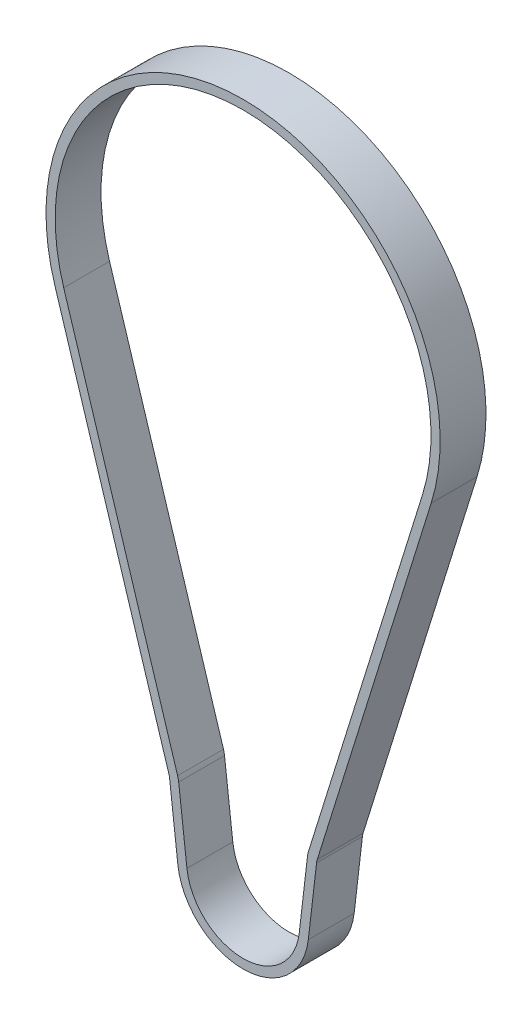
ISO-10303-21;
HEADER;
FILE_DESCRIPTION(('STEP AP214'),'2;1');
FILE_NAME('part.step','',(''),(''),'','','');
FILE_SCHEMA(('AUTOMOTIVE_DESIGN { 1 0 10303 214 1 1 1 1 }'));
ENDSEC;
DATA;
#1=APPLICATION_CONTEXT('core data for automotive mechanical design processes');
#2=APPLICATION_PROTOCOL_DEFINITION('international standard','automotive_design',2000,#1);
#3=PRODUCT_CONTEXT('',#1,'mechanical');
#4=PRODUCT('Part','Part','',(#3));
#5=PRODUCT_RELATED_PRODUCT_CATEGORY('part','',(#4));
#6=PRODUCT_DEFINITION_FORMATION('','',#4);
#7=PRODUCT_DEFINITION_CONTEXT('part definition',#1,'design');
#8=PRODUCT_DEFINITION('design','',#6,#7);
#9=PRODUCT_DEFINITION_SHAPE('','',#8);
#10=(LENGTH_UNIT() NAMED_UNIT(*) SI_UNIT(.MILLI.,.METRE.));
#11=(NAMED_UNIT(*) PLANE_ANGLE_UNIT() SI_UNIT($,.RADIAN.));
#12=(NAMED_UNIT(*) SI_UNIT($,.STERADIAN.) SOLID_ANGLE_UNIT());
#13=UNCERTAINTY_MEASURE_WITH_UNIT(LENGTH_MEASURE(1.E-05),#10,'distance_accuracy_value','');
#14=(GEOMETRIC_REPRESENTATION_CONTEXT(3) GLOBAL_UNCERTAINTY_ASSIGNED_CONTEXT((#13)) GLOBAL_UNIT_ASSIGNED_CONTEXT((#10,
#11,#12)) REPRESENTATION_CONTEXT('',''));
#15=CARTESIAN_POINT('',(0.,0.,0.));
#16=DIRECTION('',(0.,0.,1.));
#17=DIRECTION('',(1.,0.,0.));
#18=AXIS2_PLACEMENT_3D('',#15,#16,#17);
#19=CARTESIAN_POINT('',(0.,0.,5.));
#20=DIRECTION('',(0.,0.,1.));
#21=DIRECTION('',(1.,0.,0.));
#22=AXIS2_PLACEMENT_3D('',#19,#20,#21);
#23=PLANE('',#22);
#24=CARTESIAN_POINT('',(0.,0.,5.));
#25=DIRECTION('',(0.,0.,1.));
#26=DIRECTION('',(1.,0.,0.));
#27=AXIS2_PLACEMENT_3D('',#24,#25,#26);
#28=CIRCLE('',#27,14.325);
#29=CARTESIAN_POINT('',(-14.2282237592873,-1.66230973517308,5.));
#30=VERTEX_POINT('',#29);
#31=CARTESIAN_POINT('',(14.2282237592873,-1.66230973517308,5.));
#32=VERTEX_POINT('',#31);
#33=EDGE_CURVE('E213',#30,#32,#28,.T.);
#34=ORIENTED_EDGE('',*,*,#33,.T.);
#35=DIRECTION('',(0.116042564409988,0.993244241486028,0.));
#36=VECTOR('',#35,1.);
#37=CARTESIAN_POINT('',(14.2282237592873,-1.66230973517308,5.));
#38=LINE('',#37,#36);
#39=CARTESIAN_POINT('',(16.0270230340559,13.73417025764,5.));
#40=VERTEX_POINT('',#39);
#41=EDGE_CURVE('E216',#32,#40,#38,.T.);
#42=ORIENTED_EDGE('',*,*,#41,.T.);
#43=CARTESIAN_POINT('',(20.,13.27,5.));
#44=DIRECTION('',(0.,0.,-1.));
#45=DIRECTION('',(1.,0.,0.));
#46=AXIS2_PLACEMENT_3D('',#43,#44,#45);
#47=CIRCLE('',#46,4.);
#48=CARTESIAN_POINT('',(16.1811524732766,14.4601275425929,5.));
#49=VERTEX_POINT('',#48);
#50=EDGE_CURVE('E219',#40,#49,#47,.T.);
#51=ORIENTED_EDGE('',*,*,#50,.T.);
#52=DIRECTION('',(0.297531885648231,0.95471188168086,0.));
#53=VECTOR('',#52,1.);
#54=CARTESIAN_POINT('',(16.1811524732766,14.4601275425929,5.));
#55=LINE('',#54,#53);
#56=CARTESIAN_POINT('',(41.0239695558265,94.1750548736955,5.));
#57=VERTEX_POINT('',#56);
#58=EDGE_CURVE('E221',#49,#57,#55,.T.);
#59=ORIENTED_EDGE('',*,*,#58,.T.);
#60=CARTESIAN_POINT('',(0.,106.96,5.));
#61=DIRECTION('',(0.,0.,1.));
#62=DIRECTION('',(1.,0.,0.));
#63=AXIS2_PLACEMENT_3D('',#60,#61,#62);
#64=CIRCLE('',#63,42.97);
#65=CARTESIAN_POINT('',(-41.0239695558265,94.1750548736955,5.));
#66=VERTEX_POINT('',#65);
#67=EDGE_CURVE('E223',#57,#66,#64,.T.);
#68=ORIENTED_EDGE('',*,*,#67,.T.);
#69=DIRECTION('',(0.297531885648231,-0.95471188168086,0.));
#70=VECTOR('',#69,1.);
#71=CARTESIAN_POINT('',(-16.1811524732766,14.4601275425929,5.));
#72=LINE('',#71,#70);
#73=CARTESIAN_POINT('',(-16.1811524732766,14.4601275425929,5.));
#74=VERTEX_POINT('',#73);
#75=EDGE_CURVE('E225',#66,#74,#72,.T.);
#76=ORIENTED_EDGE('',*,*,#75,.T.);
#77=CARTESIAN_POINT('',(-20.,13.27,5.));
#78=DIRECTION('',(0.,0.,-1.));
#79=DIRECTION('',(1.,0.,0.));
#80=AXIS2_PLACEMENT_3D('',#77,#78,#79);
#81=CIRCLE('',#80,4.);
#82=CARTESIAN_POINT('',(-16.0270230340559,13.73417025764,5.));
#83=VERTEX_POINT('',#82);
#84=EDGE_CURVE('E227',#74,#83,#81,.T.);
#85=ORIENTED_EDGE('',*,*,#84,.T.);
#86=DIRECTION('',(0.116042564409988,-0.993244241486028,0.));
#87=VECTOR('',#86,1.);
#88=CARTESIAN_POINT('',(-14.2282237592873,-1.66230973517308,5.));
#89=LINE('',#88,#87);
#90=EDGE_CURVE('E229',#83,#30,#89,.T.);
#91=ORIENTED_EDGE('',*,*,#90,.T.);
#92=EDGE_LOOP('',(#34,#42,#51,#59,#68,#76,#85,#91));
#93=FACE_BOUND('',#92,.T.);
#94=DIRECTION('',(0.116042564409989,-0.993244241486027,0.));
#95=VECTOR('',#94,1.);
#96=CARTESIAN_POINT('',(-12.2417352763153,-1.4302246063531,5.));
#97=LINE('',#96,#95);
#98=CARTESIAN_POINT('',(-14.0405345510838,13.9662553864599,5.));
#99=VERTEX_POINT('',#98);
#100=CARTESIAN_POINT('',(-12.2417352763153,-1.4302246063531,5.));
#101=VERTEX_POINT('',#100);
#102=EDGE_CURVE('E156',#99,#101,#97,.T.);
#103=ORIENTED_EDGE('',*,*,#102,.F.);
#104=CARTESIAN_POINT('',(-20.,13.27,5.));
#105=DIRECTION('',(0.,0.,-1.));
#106=DIRECTION('',(1.,0.,0.));
#107=AXIS2_PLACEMENT_3D('',#104,#105,#106);
#108=CIRCLE('',#107,6.);
#109=CARTESIAN_POINT('',(-14.2717287099148,15.0551913138894,5.));
#110=VERTEX_POINT('',#109);
#111=EDGE_CURVE('E148',#110,#99,#108,.T.);
#112=ORIENTED_EDGE('',*,*,#111,.F.);
#113=DIRECTION('',(0.297531885648232,-0.95471188168086,0.));
#114=VECTOR('',#113,1.);
#115=CARTESIAN_POINT('',(-14.2717287099148,15.0551913138894,5.));
#116=LINE('',#115,#114);
#117=CARTESIAN_POINT('',(-39.1145457924648,94.770118644992,5.));
#118=VERTEX_POINT('',#117);
#119=EDGE_CURVE('E181',#118,#110,#116,.T.);
#120=ORIENTED_EDGE('',*,*,#119,.F.);
#121=CARTESIAN_POINT('',(0.,106.96,5.));
#122=DIRECTION('',(0.,0.,1.));
#123=DIRECTION('',(1.,0.,0.));
#124=AXIS2_PLACEMENT_3D('',#121,#122,#123);
#125=CIRCLE('',#124,40.97);
#126=CARTESIAN_POINT('',(39.1145457924648,94.770118644992,5.));
#127=VERTEX_POINT('',#126);
#128=EDGE_CURVE('E179',#127,#118,#125,.T.);
#129=ORIENTED_EDGE('',*,*,#128,.F.);
#130=DIRECTION('',(0.297531885648231,0.95471188168086,0.));
#131=VECTOR('',#130,1.);
#132=CARTESIAN_POINT('',(14.2717287099148,15.0551913138894,5.));
#133=LINE('',#132,#131);
#134=CARTESIAN_POINT('',(14.2717287099148,15.0551913138894,5.));
#135=VERTEX_POINT('',#134);
#136=EDGE_CURVE('E177',#135,#127,#133,.T.);
#137=ORIENTED_EDGE('',*,*,#136,.F.);
#138=CARTESIAN_POINT('',(20.,13.27,5.));
#139=DIRECTION('',(0.,0.,-1.));
#140=DIRECTION('',(1.,0.,0.));
#141=AXIS2_PLACEMENT_3D('',#138,#139,#140);
#142=CIRCLE('',#141,6.);
#143=CARTESIAN_POINT('',(14.0405345510838,13.9662553864599,5.));
#144=VERTEX_POINT('',#143);
#145=EDGE_CURVE('E175',#144,#135,#142,.T.);
#146=ORIENTED_EDGE('',*,*,#145,.F.);
#147=DIRECTION('',(0.116042564409988,0.993244241486027,0.));
#148=VECTOR('',#147,1.);
#149=CARTESIAN_POINT('',(12.2417352763153,-1.43022460635311,5.));
#150=LINE('',#149,#148);
#151=CARTESIAN_POINT('',(12.2417352763153,-1.43022460635311,5.));
#152=VERTEX_POINT('',#151);
#153=EDGE_CURVE('E171',#152,#144,#150,.T.);
#154=ORIENTED_EDGE('',*,*,#153,.F.);
#155=CARTESIAN_POINT('',(0.,0.,5.));
#156=DIRECTION('',(0.,0.,1.));
#157=DIRECTION('',(1.,0.,0.));
#158=AXIS2_PLACEMENT_3D('',#155,#156,#157);
#159=CIRCLE('',#158,12.325);
#160=EDGE_CURVE('E169',#101,#152,#159,.T.);
#161=ORIENTED_EDGE('',*,*,#160,.F.);
#162=EDGE_LOOP('',(#103,#112,#120,#129,#137,#146,#154,#161));
#163=FACE_BOUND('',#162,.T.);
#164=ADVANCED_FACE('F35',(#93,#163),#23,.T.);
#165=CARTESIAN_POINT('',(0.,0.,-5.));
#166=DIRECTION('',(0.,0.,1.));
#167=DIRECTION('',(1.,0.,0.));
#168=AXIS2_PLACEMENT_3D('',#165,#166,#167);
#169=PLANE('',#168);
#170=CARTESIAN_POINT('',(0.,0.,-5.));
#171=DIRECTION('',(0.,0.,1.));
#172=DIRECTION('',(1.,0.,0.));
#173=AXIS2_PLACEMENT_3D('',#170,#171,#172);
#174=CIRCLE('',#173,14.325);
#175=CARTESIAN_POINT('',(-14.2282237592873,-1.66230973517308,-5.));
#176=VERTEX_POINT('',#175);
#177=CARTESIAN_POINT('',(14.2282237592873,-1.66230973517308,-5.));
#178=VERTEX_POINT('',#177);
#179=EDGE_CURVE('E164',#176,#178,#174,.T.);
#180=ORIENTED_EDGE('',*,*,#179,.F.);
#181=DIRECTION('',(0.116042564409988,-0.993244241486028,0.));
#182=VECTOR('',#181,1.);
#183=CARTESIAN_POINT('',(-14.2282237592873,-1.66230973517308,-5.));
#184=LINE('',#183,#182);
#185=CARTESIAN_POINT('',(-16.0270230340559,13.73417025764,-5.));
#186=VERTEX_POINT('',#185);
#187=EDGE_CURVE('E217',#186,#176,#184,.T.);
#188=ORIENTED_EDGE('',*,*,#187,.F.);
#189=CARTESIAN_POINT('',(-20.,13.27,-5.));
#190=DIRECTION('',(0.,0.,-1.));
#191=DIRECTION('',(1.,0.,0.));
#192=AXIS2_PLACEMENT_3D('',#189,#190,#191);
#193=CIRCLE('',#192,4.);
#194=CARTESIAN_POINT('',(-16.1811524732766,14.4601275425929,-5.));
#195=VERTEX_POINT('',#194);
#196=EDGE_CURVE('E244',#195,#186,#193,.T.);
#197=ORIENTED_EDGE('',*,*,#196,.F.);
#198=DIRECTION('',(0.297531885648231,-0.95471188168086,0.));
#199=VECTOR('',#198,1.);
#200=CARTESIAN_POINT('',(-16.1811524732766,14.4601275425929,-5.));
#201=LINE('',#200,#199);
#202=CARTESIAN_POINT('',(-41.0239695558265,94.1750548736955,-5.));
#203=VERTEX_POINT('',#202);
#204=EDGE_CURVE('E242',#203,#195,#201,.T.);
#205=ORIENTED_EDGE('',*,*,#204,.F.);
#206=CARTESIAN_POINT('',(0.,106.96,-5.));
#207=DIRECTION('',(0.,0.,1.));
#208=DIRECTION('',(1.,0.,0.));
#209=AXIS2_PLACEMENT_3D('',#206,#207,#208);
#210=CIRCLE('',#209,42.97);
#211=CARTESIAN_POINT('',(41.0239695558265,94.1750548736955,-5.));
#212=VERTEX_POINT('',#211);
#213=EDGE_CURVE('E240',#212,#203,#210,.T.);
#214=ORIENTED_EDGE('',*,*,#213,.F.);
#215=DIRECTION('',(0.297531885648231,0.95471188168086,0.));
#216=VECTOR('',#215,1.);
#217=CARTESIAN_POINT('',(16.1811524732766,14.4601275425929,-5.));
#218=LINE('',#217,#216);
#219=CARTESIAN_POINT('',(16.1811524732766,14.4601275425929,-5.));
#220=VERTEX_POINT('',#219);
#221=EDGE_CURVE('E238',#220,#212,#218,.T.);
#222=ORIENTED_EDGE('',*,*,#221,.F.);
#223=CARTESIAN_POINT('',(20.,13.27,-5.));
#224=DIRECTION('',(0.,0.,-1.));
#225=DIRECTION('',(1.,0.,0.));
#226=AXIS2_PLACEMENT_3D('',#223,#224,#225);
#227=CIRCLE('',#226,4.);
#228=CARTESIAN_POINT('',(16.0270230340559,13.73417025764,-5.));
#229=VERTEX_POINT('',#228);
#230=EDGE_CURVE('E236',#229,#220,#227,.T.);
#231=ORIENTED_EDGE('',*,*,#230,.F.);
#232=DIRECTION('',(0.116042564409988,0.993244241486028,0.));
#233=VECTOR('',#232,1.);
#234=CARTESIAN_POINT('',(14.2282237592873,-1.66230973517308,-5.));
#235=LINE('',#234,#233);
#236=EDGE_CURVE('E234',#178,#229,#235,.T.);
#237=ORIENTED_EDGE('',*,*,#236,.F.);
#238=EDGE_LOOP('',(#180,#188,#197,#205,#214,#222,#231,#237));
#239=FACE_BOUND('',#238,.T.);
#240=CARTESIAN_POINT('',(-20.,13.27,-5.));
#241=DIRECTION('',(0.,0.,-1.));
#242=DIRECTION('',(1.,0.,0.));
#243=AXIS2_PLACEMENT_3D('',#240,#241,#242);
#244=CIRCLE('',#243,6.);
#245=CARTESIAN_POINT('',(-14.2717287099148,15.0551913138894,-5.));
#246=VERTEX_POINT('',#245);
#247=CARTESIAN_POINT('',(-14.0405345510838,13.9662553864599,-5.));
#248=VERTEX_POINT('',#247);
#249=EDGE_CURVE('E58',#246,#248,#244,.T.);
#250=ORIENTED_EDGE('',*,*,#249,.T.);
#251=DIRECTION('',(0.116042564409989,-0.993244241486027,0.));
#252=VECTOR('',#251,1.);
#253=CARTESIAN_POINT('',(-12.2417352763153,-1.4302246063531,-5.));
#254=LINE('',#253,#252);
#255=CARTESIAN_POINT('',(-12.2417352763153,-1.4302246063531,-5.));
#256=VERTEX_POINT('',#255);
#257=EDGE_CURVE('E163',#248,#256,#254,.T.);
#258=ORIENTED_EDGE('',*,*,#257,.T.);
#259=CARTESIAN_POINT('',(0.,0.,-5.));
#260=DIRECTION('',(0.,0.,1.));
#261=DIRECTION('',(1.,0.,0.));
#262=AXIS2_PLACEMENT_3D('',#259,#260,#261);
#263=CIRCLE('',#262,12.325);
#264=CARTESIAN_POINT('',(12.2417352763153,-1.43022460635311,-5.));
#265=VERTEX_POINT('',#264);
#266=EDGE_CURVE('E185',#256,#265,#263,.T.);
#267=ORIENTED_EDGE('',*,*,#266,.T.);
#268=DIRECTION('',(0.116042564409988,0.993244241486027,0.));
#269=VECTOR('',#268,1.);
#270=CARTESIAN_POINT('',(12.2417352763153,-1.43022460635311,-5.));
#271=LINE('',#270,#269);
#272=CARTESIAN_POINT('',(14.0405345510838,13.9662553864599,-5.));
#273=VERTEX_POINT('',#272);
#274=EDGE_CURVE('E188',#265,#273,#271,.T.);
#275=ORIENTED_EDGE('',*,*,#274,.T.);
#276=CARTESIAN_POINT('',(20.,13.27,-5.));
#277=DIRECTION('',(0.,0.,-1.));
#278=DIRECTION('',(1.,0.,0.));
#279=AXIS2_PLACEMENT_3D('',#276,#277,#278);
#280=CIRCLE('',#279,6.);
#281=CARTESIAN_POINT('',(14.2717287099148,15.0551913138894,-5.));
#282=VERTEX_POINT('',#281);
#283=EDGE_CURVE('E191',#273,#282,#280,.T.);
#284=ORIENTED_EDGE('',*,*,#283,.T.);
#285=DIRECTION('',(0.297531885648231,0.95471188168086,0.));
#286=VECTOR('',#285,1.);
#287=CARTESIAN_POINT('',(14.2717287099148,15.0551913138894,-5.));
#288=LINE('',#287,#286);
#289=CARTESIAN_POINT('',(39.1145457924648,94.770118644992,-5.));
#290=VERTEX_POINT('',#289);
#291=EDGE_CURVE('E194',#282,#290,#288,.T.);
#292=ORIENTED_EDGE('',*,*,#291,.T.);
#293=CARTESIAN_POINT('',(0.,106.96,-5.));
#294=DIRECTION('',(0.,0.,1.));
#295=DIRECTION('',(1.,0.,0.));
#296=AXIS2_PLACEMENT_3D('',#293,#294,#295);
#297=CIRCLE('',#296,40.97);
#298=CARTESIAN_POINT('',(-39.1145457924648,94.770118644992,-5.));
#299=VERTEX_POINT('',#298);
#300=EDGE_CURVE('E197',#290,#299,#297,.T.);
#301=ORIENTED_EDGE('',*,*,#300,.T.);
#302=DIRECTION('',(0.297531885648232,-0.95471188168086,0.));
#303=VECTOR('',#302,1.);
#304=CARTESIAN_POINT('',(-14.2717287099148,15.0551913138894,-5.));
#305=LINE('',#304,#303);
#306=EDGE_CURVE('E157',#299,#246,#305,.T.);
#307=ORIENTED_EDGE('',*,*,#306,.T.);
#308=EDGE_LOOP('',(#250,#258,#267,#275,#284,#292,#301,#307));
#309=FACE_BOUND('',#308,.T.);
#310=ADVANCED_FACE('F274',(#239,#309),#169,.F.);
#311=CARTESIAN_POINT('',(0.,0.,5.));
#312=DIRECTION('',(0.,0.,-1.));
#313=DIRECTION('',(-1.,0.,0.));
#314=AXIS2_PLACEMENT_3D('',#311,#312,#313);
#315=CYLINDRICAL_SURFACE('',#314,14.325);
#316=ORIENTED_EDGE('',*,*,#179,.T.);
#317=DIRECTION('',(0.,0.,-1.));
#318=VECTOR('',#317,1.);
#319=CARTESIAN_POINT('',(14.2282237592873,-1.66230973517308,5.));
#320=LINE('',#319,#318);
#321=EDGE_CURVE('E11',#32,#178,#320,.T.);
#322=ORIENTED_EDGE('',*,*,#321,.F.);
#323=ORIENTED_EDGE('',*,*,#33,.F.);
#324=DIRECTION('',(0.,0.,-1.));
#325=VECTOR('',#324,1.);
#326=CARTESIAN_POINT('',(-14.2282237592873,-1.66230973517308,5.));
#327=LINE('',#326,#325);
#328=EDGE_CURVE('E231',#30,#176,#327,.T.);
#329=ORIENTED_EDGE('',*,*,#328,.T.);
#330=EDGE_LOOP('',(#316,#322,#323,#329));
#331=FACE_BOUND('',#330,.T.);
#332=ADVANCED_FACE('F37',(#331),#315,.T.);
#333=CARTESIAN_POINT('',(14.2282237592873,-1.66230973517308,5.));
#334=DIRECTION('',(-0.993244241486027,0.116042564409988,0.));
#335=DIRECTION('',(-0.116042564409988,-0.993244241486027,0.));
#336=AXIS2_PLACEMENT_3D('',#333,#334,#335);
#337=PLANE('',#336);
#338=ORIENTED_EDGE('',*,*,#236,.T.);
#339=DIRECTION('',(0.,0.,-1.));
#340=VECTOR('',#339,1.);
#341=CARTESIAN_POINT('',(16.0270230340559,13.73417025764,5.));
#342=LINE('',#341,#340);
#343=EDGE_CURVE('E43',#40,#229,#342,.T.);
#344=ORIENTED_EDGE('',*,*,#343,.F.);
#345=ORIENTED_EDGE('',*,*,#41,.F.);
#346=ORIENTED_EDGE('',*,*,#321,.T.);
#347=EDGE_LOOP('',(#338,#344,#345,#346));
#348=FACE_BOUND('',#347,.T.);
#349=ADVANCED_FACE('F291',(#348),#337,.F.);
#350=CARTESIAN_POINT('',(20.,13.27,5.));
#351=DIRECTION('',(0.,0.,-1.));
#352=DIRECTION('',(-1.,0.,0.));
#353=AXIS2_PLACEMENT_3D('',#350,#351,#352);
#354=CYLINDRICAL_SURFACE('',#353,4.);
#355=ORIENTED_EDGE('',*,*,#230,.T.);
#356=DIRECTION('',(0.,0.,-1.));
#357=VECTOR('',#356,1.);
#358=CARTESIAN_POINT('',(16.1811524732766,14.4601275425929,5.));
#359=LINE('',#358,#357);
#360=EDGE_CURVE('E261',#49,#220,#359,.T.);
#361=ORIENTED_EDGE('',*,*,#360,.F.);
#362=ORIENTED_EDGE('',*,*,#50,.F.);
#363=ORIENTED_EDGE('',*,*,#343,.T.);
#364=EDGE_LOOP('',(#355,#361,#362,#363));
#365=FACE_BOUND('',#364,.T.);
#366=ADVANCED_FACE('F268',(#365),#354,.F.);
#367=CARTESIAN_POINT('',(16.1811524732766,14.4601275425929,5.));
#368=DIRECTION('',(-0.95471188168086,0.297531885648231,0.));
#369=DIRECTION('',(-0.297531885648231,-0.95471188168086,0.));
#370=AXIS2_PLACEMENT_3D('',#367,#368,#369);
#371=PLANE('',#370);
#372=ORIENTED_EDGE('',*,*,#221,.T.);
#373=DIRECTION('',(0.,0.,-1.));
#374=VECTOR('',#373,1.);
#375=CARTESIAN_POINT('',(41.0239695558265,94.1750548736955,5.));
#376=LINE('',#375,#374);
#377=EDGE_CURVE('E258',#57,#212,#376,.T.);
#378=ORIENTED_EDGE('',*,*,#377,.F.);
#379=ORIENTED_EDGE('',*,*,#58,.F.);
#380=ORIENTED_EDGE('',*,*,#360,.T.);
#381=EDGE_LOOP('',(#372,#378,#379,#380));
#382=FACE_BOUND('',#381,.T.);
#383=ADVANCED_FACE('F280',(#382),#371,.F.);
#384=CARTESIAN_POINT('',(0.,106.96,5.));
#385=DIRECTION('',(0.,0.,-1.));
#386=DIRECTION('',(-1.,0.,0.));
#387=AXIS2_PLACEMENT_3D('',#384,#385,#386);
#388=CYLINDRICAL_SURFACE('',#387,42.97);
#389=ORIENTED_EDGE('',*,*,#213,.T.);
#390=DIRECTION('',(0.,0.,-1.));
#391=VECTOR('',#390,1.);
#392=CARTESIAN_POINT('',(-41.0239695558265,94.1750548736955,5.));
#393=LINE('',#392,#391);
#394=EDGE_CURVE('E255',#66,#203,#393,.T.);
#395=ORIENTED_EDGE('',*,*,#394,.F.);
#396=ORIENTED_EDGE('',*,*,#67,.F.);
#397=ORIENTED_EDGE('',*,*,#377,.T.);
#398=EDGE_LOOP('',(#389,#395,#396,#397));
#399=FACE_BOUND('',#398,.T.);
#400=ADVANCED_FACE('F284',(#399),#388,.T.);
#401=CARTESIAN_POINT('',(-16.1811524732766,14.4601275425929,5.));
#402=DIRECTION('',(0.95471188168086,0.297531885648231,0.));
#403=DIRECTION('',(-0.297531885648231,0.95471188168086,0.));
#404=AXIS2_PLACEMENT_3D('',#401,#402,#403);
#405=PLANE('',#404);
#406=ORIENTED_EDGE('',*,*,#204,.T.);
#407=DIRECTION('',(0.,0.,-1.));
#408=VECTOR('',#407,1.);
#409=CARTESIAN_POINT('',(-16.1811524732766,14.4601275425929,5.));
#410=LINE('',#409,#408);
#411=EDGE_CURVE('E252',#74,#195,#410,.T.);
#412=ORIENTED_EDGE('',*,*,#411,.F.);
#413=ORIENTED_EDGE('',*,*,#75,.F.);
#414=ORIENTED_EDGE('',*,*,#394,.T.);
#415=EDGE_LOOP('',(#406,#412,#413,#414));
#416=FACE_BOUND('',#415,.T.);
#417=ADVANCED_FACE('F304',(#416),#405,.F.);
#418=CARTESIAN_POINT('',(-20.,13.27,5.));
#419=DIRECTION('',(0.,0.,-1.));
#420=DIRECTION('',(-1.,0.,0.));
#421=AXIS2_PLACEMENT_3D('',#418,#419,#420);
#422=CYLINDRICAL_SURFACE('',#421,4.);
#423=ORIENTED_EDGE('',*,*,#196,.T.);
#424=DIRECTION('',(0.,0.,-1.));
#425=VECTOR('',#424,1.);
#426=CARTESIAN_POINT('',(-16.0270230340559,13.73417025764,5.));
#427=LINE('',#426,#425);
#428=EDGE_CURVE('E249',#83,#186,#427,.T.);
#429=ORIENTED_EDGE('',*,*,#428,.F.);
#430=ORIENTED_EDGE('',*,*,#84,.F.);
#431=ORIENTED_EDGE('',*,*,#411,.T.);
#432=EDGE_LOOP('',(#423,#429,#430,#431));
#433=FACE_BOUND('',#432,.T.);
#434=ADVANCED_FACE('F302',(#433),#422,.F.);
#435=CARTESIAN_POINT('',(-14.2282237592873,-1.66230973517308,5.));
#436=DIRECTION('',(0.993244241486027,0.116042564409988,0.));
#437=DIRECTION('',(-0.116042564409988,0.993244241486027,0.));
#438=AXIS2_PLACEMENT_3D('',#435,#436,#437);
#439=PLANE('',#438);
#440=ORIENTED_EDGE('',*,*,#187,.T.);
#441=ORIENTED_EDGE('',*,*,#328,.F.);
#442=ORIENTED_EDGE('',*,*,#90,.F.);
#443=ORIENTED_EDGE('',*,*,#428,.T.);
#444=EDGE_LOOP('',(#440,#441,#442,#443));
#445=FACE_BOUND('',#444,.T.);
#446=ADVANCED_FACE('F297',(#445),#439,.F.);
#447=CARTESIAN_POINT('',(-20.,13.27,5.));
#448=DIRECTION('',(0.,0.,-1.));
#449=DIRECTION('',(-1.,0.,0.));
#450=AXIS2_PLACEMENT_3D('',#447,#448,#449);
#451=CYLINDRICAL_SURFACE('',#450,6.);
#452=ORIENTED_EDGE('',*,*,#249,.F.);
#453=DIRECTION('',(0.,0.,-1.));
#454=VECTOR('',#453,1.);
#455=CARTESIAN_POINT('',(-14.2717287099148,15.0551913138894,5.));
#456=LINE('',#455,#454);
#457=EDGE_CURVE('E152',#110,#246,#456,.T.);
#458=ORIENTED_EDGE('',*,*,#457,.F.);
#459=ORIENTED_EDGE('',*,*,#111,.T.);
#460=DIRECTION('',(0.,0.,-1.));
#461=VECTOR('',#460,1.);
#462=CARTESIAN_POINT('',(-14.0405345510838,13.9662553864599,5.));
#463=LINE('',#462,#461);
#464=EDGE_CURVE('E151',#99,#248,#463,.T.);
#465=ORIENTED_EDGE('',*,*,#464,.T.);
#466=EDGE_LOOP('',(#452,#458,#459,#465));
#467=FACE_BOUND('',#466,.T.);
#468=ADVANCED_FACE('F150',(#467),#451,.T.);
#469=CARTESIAN_POINT('',(-12.2417352763153,-1.4302246063531,5.));
#470=DIRECTION('',(0.993244241486027,0.116042564409989,0.));
#471=DIRECTION('',(-0.116042564409989,0.993244241486027,0.));
#472=AXIS2_PLACEMENT_3D('',#469,#470,#471);
#473=PLANE('',#472);
#474=ORIENTED_EDGE('',*,*,#257,.F.);
#475=ORIENTED_EDGE('',*,*,#464,.F.);
#476=ORIENTED_EDGE('',*,*,#102,.T.);
#477=DIRECTION('',(0.,0.,-1.));
#478=VECTOR('',#477,1.);
#479=CARTESIAN_POINT('',(-12.2417352763153,-1.4302246063531,5.));
#480=LINE('',#479,#478);
#481=EDGE_CURVE('E165',#101,#256,#480,.T.);
#482=ORIENTED_EDGE('',*,*,#481,.T.);
#483=EDGE_LOOP('',(#474,#475,#476,#482));
#484=FACE_BOUND('',#483,.T.);
#485=ADVANCED_FACE('F160',(#484),#473,.T.);
#486=CARTESIAN_POINT('',(0.,0.,5.));
#487=DIRECTION('',(0.,0.,-1.));
#488=DIRECTION('',(-1.,0.,0.));
#489=AXIS2_PLACEMENT_3D('',#486,#487,#488);
#490=CYLINDRICAL_SURFACE('',#489,12.325);
#491=ORIENTED_EDGE('',*,*,#266,.F.);
#492=ORIENTED_EDGE('',*,*,#481,.F.);
#493=ORIENTED_EDGE('',*,*,#160,.T.);
#494=DIRECTION('',(0.,0.,-1.));
#495=VECTOR('',#494,1.);
#496=CARTESIAN_POINT('',(12.2417352763153,-1.43022460635311,5.));
#497=LINE('',#496,#495);
#498=EDGE_CURVE('E210',#152,#265,#497,.T.);
#499=ORIENTED_EDGE('',*,*,#498,.T.);
#500=EDGE_LOOP('',(#491,#492,#493,#499));
#501=FACE_BOUND('',#500,.T.);
#502=ADVANCED_FACE('F329',(#501),#490,.F.);
#503=CARTESIAN_POINT('',(12.2417352763153,-1.43022460635311,5.));
#504=DIRECTION('',(-0.993244241486027,0.116042564409988,0.));
#505=DIRECTION('',(-0.116042564409988,-0.993244241486027,0.));
#506=AXIS2_PLACEMENT_3D('',#503,#504,#505);
#507=PLANE('',#506);
#508=ORIENTED_EDGE('',*,*,#274,.F.);
#509=ORIENTED_EDGE('',*,*,#498,.F.);
#510=ORIENTED_EDGE('',*,*,#153,.T.);
#511=DIRECTION('',(0.,0.,-1.));
#512=VECTOR('',#511,1.);
#513=CARTESIAN_POINT('',(14.0405345510838,13.9662553864599,5.));
#514=LINE('',#513,#512);
#515=EDGE_CURVE('E208',#144,#273,#514,.T.);
#516=ORIENTED_EDGE('',*,*,#515,.T.);
#517=EDGE_LOOP('',(#508,#509,#510,#516));
#518=FACE_BOUND('',#517,.T.);
#519=ADVANCED_FACE('F333',(#518),#507,.T.);
#520=CARTESIAN_POINT('',(20.,13.27,5.));
#521=DIRECTION('',(0.,0.,-1.));
#522=DIRECTION('',(-1.,0.,0.));
#523=AXIS2_PLACEMENT_3D('',#520,#521,#522);
#524=CYLINDRICAL_SURFACE('',#523,6.);
#525=ORIENTED_EDGE('',*,*,#283,.F.);
#526=ORIENTED_EDGE('',*,*,#515,.F.);
#527=ORIENTED_EDGE('',*,*,#145,.T.);
#528=DIRECTION('',(0.,0.,-1.));
#529=VECTOR('',#528,1.);
#530=CARTESIAN_POINT('',(14.2717287099148,15.0551913138894,5.));
#531=LINE('',#530,#529);
#532=EDGE_CURVE('E206',#135,#282,#531,.T.);
#533=ORIENTED_EDGE('',*,*,#532,.T.);
#534=EDGE_LOOP('',(#525,#526,#527,#533));
#535=FACE_BOUND('',#534,.T.);
#536=ADVANCED_FACE('F339',(#535),#524,.T.);
#537=CARTESIAN_POINT('',(14.2717287099148,15.0551913138894,5.));
#538=DIRECTION('',(-0.95471188168086,0.297531885648231,0.));
#539=DIRECTION('',(-0.297531885648231,-0.95471188168086,0.));
#540=AXIS2_PLACEMENT_3D('',#537,#538,#539);
#541=PLANE('',#540);
#542=ORIENTED_EDGE('',*,*,#291,.F.);
#543=ORIENTED_EDGE('',*,*,#532,.F.);
#544=ORIENTED_EDGE('',*,*,#136,.T.);
#545=DIRECTION('',(0.,0.,-1.));
#546=VECTOR('',#545,1.);
#547=CARTESIAN_POINT('',(39.1145457924648,94.770118644992,5.));
#548=LINE('',#547,#546);
#549=EDGE_CURVE('E204',#127,#290,#548,.T.);
#550=ORIENTED_EDGE('',*,*,#549,.T.);
#551=EDGE_LOOP('',(#542,#543,#544,#550));
#552=FACE_BOUND('',#551,.T.);
#553=ADVANCED_FACE('F343',(#552),#541,.T.);
#554=CARTESIAN_POINT('',(0.,106.96,5.));
#555=DIRECTION('',(0.,0.,-1.));
#556=DIRECTION('',(-1.,0.,0.));
#557=AXIS2_PLACEMENT_3D('',#554,#555,#556);
#558=CYLINDRICAL_SURFACE('',#557,40.97);
#559=ORIENTED_EDGE('',*,*,#300,.F.);
#560=ORIENTED_EDGE('',*,*,#549,.F.);
#561=ORIENTED_EDGE('',*,*,#128,.T.);
#562=DIRECTION('',(0.,0.,-1.));
#563=VECTOR('',#562,1.);
#564=CARTESIAN_POINT('',(-39.1145457924648,94.770118644992,5.));
#565=LINE('',#564,#563);
#566=EDGE_CURVE('E50',#118,#299,#565,.T.);
#567=ORIENTED_EDGE('',*,*,#566,.T.);
#568=EDGE_LOOP('',(#559,#560,#561,#567));
#569=FACE_BOUND('',#568,.T.);
#570=ADVANCED_FACE('F347',(#569),#558,.F.);
#571=CARTESIAN_POINT('',(-14.2717287099148,15.0551913138894,5.));
#572=DIRECTION('',(0.95471188168086,0.297531885648232,0.));
#573=DIRECTION('',(-0.297531885648232,0.95471188168086,0.));
#574=AXIS2_PLACEMENT_3D('',#571,#572,#573);
#575=PLANE('',#574);
#576=ORIENTED_EDGE('',*,*,#306,.F.);
#577=ORIENTED_EDGE('',*,*,#566,.F.);
#578=ORIENTED_EDGE('',*,*,#119,.T.);
#579=ORIENTED_EDGE('',*,*,#457,.T.);
#580=EDGE_LOOP('',(#576,#577,#578,#579));
#581=FACE_BOUND('',#580,.T.);
#582=ADVANCED_FACE('F351',(#581),#575,.T.);
#583=CLOSED_SHELL('',(#164,#310,#332,#349,#366,#383,#400,#417,#434,#446,#468,#485,#502,#519,
#536,#553,#570,#582));
#584=MANIFOLD_SOLID_BREP('B2',#583);
#585=ADVANCED_BREP_SHAPE_REPRESENTATION('',(#18,#584),#14);
#586=SHAPE_DEFINITION_REPRESENTATION(#9,#585);
ENDSEC;
END-ISO-10303-21;
